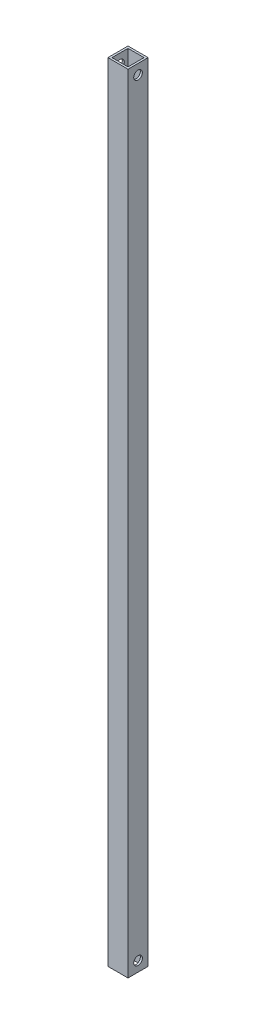
ISO-10303-21;
HEADER;
FILE_DESCRIPTION(('STEP AP214'),'2;1');
FILE_NAME('part.step','',(''),(''),'','','');
FILE_SCHEMA(('AUTOMOTIVE_DESIGN { 1 0 10303 214 1 1 1 1 }'));
ENDSEC;
DATA;
#1=APPLICATION_CONTEXT('core data for automotive mechanical design processes');
#2=APPLICATION_PROTOCOL_DEFINITION('international standard','automotive_design',2000,#1);
#3=PRODUCT_CONTEXT('',#1,'mechanical');
#4=PRODUCT('Part','Part','',(#3));
#5=PRODUCT_RELATED_PRODUCT_CATEGORY('part','',(#4));
#6=PRODUCT_DEFINITION_FORMATION('','',#4);
#7=PRODUCT_DEFINITION_CONTEXT('part definition',#1,'design');
#8=PRODUCT_DEFINITION('design','',#6,#7);
#9=PRODUCT_DEFINITION_SHAPE('','',#8);
#10=(LENGTH_UNIT() NAMED_UNIT(*) SI_UNIT(.MILLI.,.METRE.));
#11=(NAMED_UNIT(*) PLANE_ANGLE_UNIT() SI_UNIT($,.RADIAN.));
#12=(NAMED_UNIT(*) SI_UNIT($,.STERADIAN.) SOLID_ANGLE_UNIT());
#13=UNCERTAINTY_MEASURE_WITH_UNIT(LENGTH_MEASURE(1.E-05),#10,'distance_accuracy_value','');
#14=(GEOMETRIC_REPRESENTATION_CONTEXT(3) GLOBAL_UNCERTAINTY_ASSIGNED_CONTEXT((#13)) GLOBAL_UNIT_ASSIGNED_CONTEXT((#10,
#11,#12)) REPRESENTATION_CONTEXT('',''));
#15=CARTESIAN_POINT('',(0.,0.,0.));
#16=DIRECTION('',(0.,0.,1.));
#17=DIRECTION('',(1.,0.,0.));
#18=AXIS2_PLACEMENT_3D('',#15,#16,#17);
#19=CARTESIAN_POINT('',(0.,391.837661840736,0.));
#20=DIRECTION('',(0.,1.,0.));
#21=DIRECTION('',(0.,0.,1.));
#22=AXIS2_PLACEMENT_3D('',#19,#20,#21);
#23=PLANE('',#22);
#24=DIRECTION('',(0.,0.,-1.));
#25=VECTOR('',#24,1.);
#26=CARTESIAN_POINT('',(5.,391.837661840736,-5.));
#27=LINE('',#26,#25);
#28=CARTESIAN_POINT('',(5.,391.837661840736,5.));
#29=VERTEX_POINT('',#28);
#30=CARTESIAN_POINT('',(5.,391.837661840736,-5.));
#31=VERTEX_POINT('',#30);
#32=EDGE_CURVE('E164',#29,#31,#27,.T.);
#33=ORIENTED_EDGE('',*,*,#32,.T.);
#34=DIRECTION('',(-1.,0.,0.));
#35=VECTOR('',#34,1.);
#36=CARTESIAN_POINT('',(-5.,391.837661840736,-5.));
#37=LINE('',#36,#35);
#38=CARTESIAN_POINT('',(-5.,391.837661840736,-5.));
#39=VERTEX_POINT('',#38);
#40=EDGE_CURVE('E167',#31,#39,#37,.T.);
#41=ORIENTED_EDGE('',*,*,#40,.T.);
#42=DIRECTION('',(0.,0.,1.));
#43=VECTOR('',#42,1.);
#44=CARTESIAN_POINT('',(-5.,391.837661840736,-5.));
#45=LINE('',#44,#43);
#46=CARTESIAN_POINT('',(-5.,391.837661840736,5.));
#47=VERTEX_POINT('',#46);
#48=EDGE_CURVE('E170',#39,#47,#45,.T.);
#49=ORIENTED_EDGE('',*,*,#48,.T.);
#50=DIRECTION('',(1.,0.,0.));
#51=VECTOR('',#50,1.);
#52=CARTESIAN_POINT('',(-5.,391.837661840736,5.));
#53=LINE('',#52,#51);
#54=EDGE_CURVE('E172',#47,#29,#53,.T.);
#55=ORIENTED_EDGE('',*,*,#54,.T.);
#56=EDGE_LOOP('',(#33,#41,#49,#55));
#57=FACE_BOUND('',#56,.T.);
#58=DIRECTION('',(-1.,0.,0.));
#59=VECTOR('',#58,1.);
#60=CARTESIAN_POINT('',(-5.,391.837661840736,-4.));
#61=LINE('',#60,#59);
#62=CARTESIAN_POINT('',(4.,391.837661840736,-4.));
#63=VERTEX_POINT('',#62);
#64=CARTESIAN_POINT('',(-4.,391.837661840736,-4.));
#65=VERTEX_POINT('',#64);
#66=EDGE_CURVE('E134',#63,#65,#61,.T.);
#67=ORIENTED_EDGE('',*,*,#66,.F.);
#68=DIRECTION('',(0.,0.,-1.));
#69=VECTOR('',#68,1.);
#70=CARTESIAN_POINT('',(4.,391.837661840736,-5.));
#71=LINE('',#70,#69);
#72=CARTESIAN_POINT('',(4.,391.837661840736,4.));
#73=VERTEX_POINT('',#72);
#74=EDGE_CURVE('E126',#73,#63,#71,.T.);
#75=ORIENTED_EDGE('',*,*,#74,.F.);
#76=DIRECTION('',(1.,0.,0.));
#77=VECTOR('',#76,1.);
#78=CARTESIAN_POINT('',(-5.,391.837661840736,4.));
#79=LINE('',#78,#77);
#80=CARTESIAN_POINT('',(-4.,391.837661840736,4.));
#81=VERTEX_POINT('',#80);
#82=EDGE_CURVE('E148',#81,#73,#79,.T.);
#83=ORIENTED_EDGE('',*,*,#82,.F.);
#84=DIRECTION('',(0.,0.,1.));
#85=VECTOR('',#84,1.);
#86=CARTESIAN_POINT('',(-4.,391.837661840736,-5.));
#87=LINE('',#86,#85);
#88=EDGE_CURVE('E146',#65,#81,#87,.T.);
#89=ORIENTED_EDGE('',*,*,#88,.F.);
#90=EDGE_LOOP('',(#67,#75,#83,#89));
#91=FACE_BOUND('',#90,.T.);
#92=ADVANCED_FACE('F59',(#57,#91),#23,.T.);
#93=CARTESIAN_POINT('',(0.,0.,0.));
#94=DIRECTION('',(0.,1.,0.));
#95=DIRECTION('',(0.,0.,1.));
#96=AXIS2_PLACEMENT_3D('',#93,#94,#95);
#97=PLANE('',#96);
#98=DIRECTION('',(0.,0.,-1.));
#99=VECTOR('',#98,1.);
#100=CARTESIAN_POINT('',(5.,0.,-5.));
#101=LINE('',#100,#99);
#102=CARTESIAN_POINT('',(5.,0.,5.));
#103=VERTEX_POINT('',#102);
#104=CARTESIAN_POINT('',(5.,0.,-5.));
#105=VERTEX_POINT('',#104);
#106=EDGE_CURVE('E142',#103,#105,#101,.T.);
#107=ORIENTED_EDGE('',*,*,#106,.F.);
#108=DIRECTION('',(1.,0.,0.));
#109=VECTOR('',#108,1.);
#110=CARTESIAN_POINT('',(-5.,0.,5.));
#111=LINE('',#110,#109);
#112=CARTESIAN_POINT('',(-5.,0.,5.));
#113=VERTEX_POINT('',#112);
#114=EDGE_CURVE('E168',#113,#103,#111,.T.);
#115=ORIENTED_EDGE('',*,*,#114,.F.);
#116=DIRECTION('',(0.,0.,1.));
#117=VECTOR('',#116,1.);
#118=CARTESIAN_POINT('',(-5.,0.,-5.));
#119=LINE('',#118,#117);
#120=CARTESIAN_POINT('',(-5.,0.,-5.));
#121=VERTEX_POINT('',#120);
#122=EDGE_CURVE('E179',#121,#113,#119,.T.);
#123=ORIENTED_EDGE('',*,*,#122,.F.);
#124=DIRECTION('',(-1.,0.,0.));
#125=VECTOR('',#124,1.);
#126=CARTESIAN_POINT('',(-5.,0.,-5.));
#127=LINE('',#126,#125);
#128=EDGE_CURVE('E177',#105,#121,#127,.T.);
#129=ORIENTED_EDGE('',*,*,#128,.F.);
#130=EDGE_LOOP('',(#107,#115,#123,#129));
#131=FACE_BOUND('',#130,.T.);
#132=DIRECTION('',(0.,0.,-1.));
#133=VECTOR('',#132,1.);
#134=CARTESIAN_POINT('',(4.,0.,-5.));
#135=LINE('',#134,#133);
#136=CARTESIAN_POINT('',(4.,0.,4.));
#137=VERTEX_POINT('',#136);
#138=CARTESIAN_POINT('',(4.,0.,-4.));
#139=VERTEX_POINT('',#138);
#140=EDGE_CURVE('E84',#137,#139,#135,.T.);
#141=ORIENTED_EDGE('',*,*,#140,.T.);
#142=DIRECTION('',(-1.,0.,0.));
#143=VECTOR('',#142,1.);
#144=CARTESIAN_POINT('',(-5.,0.,-4.));
#145=LINE('',#144,#143);
#146=CARTESIAN_POINT('',(-4.,0.,-4.));
#147=VERTEX_POINT('',#146);
#148=EDGE_CURVE('E141',#139,#147,#145,.T.);
#149=ORIENTED_EDGE('',*,*,#148,.T.);
#150=DIRECTION('',(0.,0.,1.));
#151=VECTOR('',#150,1.);
#152=CARTESIAN_POINT('',(-4.,0.,-5.));
#153=LINE('',#152,#151);
#154=CARTESIAN_POINT('',(-4.,0.,4.));
#155=VERTEX_POINT('',#154);
#156=EDGE_CURVE('E156',#147,#155,#153,.T.);
#157=ORIENTED_EDGE('',*,*,#156,.T.);
#158=DIRECTION('',(1.,0.,0.));
#159=VECTOR('',#158,1.);
#160=CARTESIAN_POINT('',(-5.,0.,4.));
#161=LINE('',#160,#159);
#162=EDGE_CURVE('E135',#155,#137,#161,.T.);
#163=ORIENTED_EDGE('',*,*,#162,.T.);
#164=EDGE_LOOP('',(#141,#149,#157,#163));
#165=FACE_BOUND('',#164,.T.);
#166=ADVANCED_FACE('F226',(#131,#165),#97,.F.);
#167=CARTESIAN_POINT('',(5.,391.837661840736,-5.));
#168=DIRECTION('',(-1.,0.,0.));
#169=DIRECTION('',(0.,0.,1.));
#170=AXIS2_PLACEMENT_3D('',#167,#168,#169);
#171=PLANE('',#170);
#172=CARTESIAN_POINT('',(5.,5.,0.));
#173=DIRECTION('',(1.,0.,0.));
#174=DIRECTION('',(0.,0.,-1.));
#175=AXIS2_PLACEMENT_3D('',#172,#173,#174);
#176=CIRCLE('',#175,2.15);
#177=CARTESIAN_POINT('',(5.,5.,-2.15));
#178=VERTEX_POINT('',#177);
#179=EDGE_CURVE('E197',#178,#178,#176,.T.);
#180=ORIENTED_EDGE('',*,*,#179,.F.);
#181=EDGE_LOOP('',(#180));
#182=FACE_BOUND('',#181,.T.);
#183=CARTESIAN_POINT('',(5.,386.837661840736,0.));
#184=DIRECTION('',(1.,0.,0.));
#185=DIRECTION('',(0.,0.,1.));
#186=AXIS2_PLACEMENT_3D('',#183,#184,#185);
#187=CIRCLE('',#186,2.14999999999999);
#188=CARTESIAN_POINT('',(5.,386.837661840736,2.14999999999999));
#189=VERTEX_POINT('',#188);
#190=EDGE_CURVE('E207',#189,#189,#187,.T.);
#191=ORIENTED_EDGE('',*,*,#190,.F.);
#192=EDGE_LOOP('',(#191));
#193=FACE_BOUND('',#192,.T.);
#194=ORIENTED_EDGE('',*,*,#106,.T.);
#195=DIRECTION('',(0.,-1.,0.));
#196=VECTOR('',#195,1.);
#197=CARTESIAN_POINT('',(5.,391.837661840736,-5.));
#198=LINE('',#197,#196);
#199=EDGE_CURVE('E12',#31,#105,#198,.T.);
#200=ORIENTED_EDGE('',*,*,#199,.F.);
#201=ORIENTED_EDGE('',*,*,#32,.F.);
#202=DIRECTION('',(0.,-1.,0.));
#203=VECTOR('',#202,1.);
#204=CARTESIAN_POINT('',(5.,391.837661840736,5.));
#205=LINE('',#204,#203);
#206=EDGE_CURVE('E174',#29,#103,#205,.T.);
#207=ORIENTED_EDGE('',*,*,#206,.T.);
#208=EDGE_LOOP('',(#194,#200,#201,#207));
#209=FACE_BOUND('',#208,.T.);
#210=ADVANCED_FACE('F61',(#182,#193,#209),#171,.F.);
#211=CARTESIAN_POINT('',(-5.,391.837661840736,-5.));
#212=DIRECTION('',(0.,0.,1.));
#213=DIRECTION('',(1.,0.,0.));
#214=AXIS2_PLACEMENT_3D('',#211,#212,#213);
#215=PLANE('',#214);
#216=ORIENTED_EDGE('',*,*,#128,.T.);
#217=DIRECTION('',(0.,-1.,0.));
#218=VECTOR('',#217,1.);
#219=CARTESIAN_POINT('',(-5.,391.837661840736,-5.));
#220=LINE('',#219,#218);
#221=EDGE_CURVE('E68',#39,#121,#220,.T.);
#222=ORIENTED_EDGE('',*,*,#221,.F.);
#223=ORIENTED_EDGE('',*,*,#40,.F.);
#224=ORIENTED_EDGE('',*,*,#199,.T.);
#225=EDGE_LOOP('',(#216,#222,#223,#224));
#226=FACE_BOUND('',#225,.T.);
#227=ADVANCED_FACE('F252',(#226),#215,.F.);
#228=CARTESIAN_POINT('',(-5.,391.837661840736,-5.));
#229=DIRECTION('',(1.,0.,0.));
#230=DIRECTION('',(0.,0.,-1.));
#231=AXIS2_PLACEMENT_3D('',#228,#229,#230);
#232=PLANE('',#231);
#233=CARTESIAN_POINT('',(-5.,5.,0.));
#234=DIRECTION('',(1.,0.,0.));
#235=DIRECTION('',(0.,0.,-1.));
#236=AXIS2_PLACEMENT_3D('',#233,#234,#235);
#237=CIRCLE('',#236,2.15);
#238=CARTESIAN_POINT('',(-5.,5.,-2.15));
#239=VERTEX_POINT('',#238);
#240=EDGE_CURVE('E191',#239,#239,#237,.T.);
#241=ORIENTED_EDGE('',*,*,#240,.T.);
#242=EDGE_LOOP('',(#241));
#243=FACE_BOUND('',#242,.T.);
#244=CARTESIAN_POINT('',(-5.,386.837661840736,0.));
#245=DIRECTION('',(1.,0.,0.));
#246=DIRECTION('',(0.,0.,1.));
#247=AXIS2_PLACEMENT_3D('',#244,#245,#246);
#248=CIRCLE('',#247,2.14999999999999);
#249=CARTESIAN_POINT('',(-5.,386.837661840736,2.14999999999999));
#250=VERTEX_POINT('',#249);
#251=EDGE_CURVE('E202',#250,#250,#248,.T.);
#252=ORIENTED_EDGE('',*,*,#251,.T.);
#253=EDGE_LOOP('',(#252));
#254=FACE_BOUND('',#253,.T.);
#255=ORIENTED_EDGE('',*,*,#122,.T.);
#256=DIRECTION('',(0.,-1.,0.));
#257=VECTOR('',#256,1.);
#258=CARTESIAN_POINT('',(-5.,391.837661840736,5.));
#259=LINE('',#258,#257);
#260=EDGE_CURVE('E184',#47,#113,#259,.T.);
#261=ORIENTED_EDGE('',*,*,#260,.F.);
#262=ORIENTED_EDGE('',*,*,#48,.F.);
#263=ORIENTED_EDGE('',*,*,#221,.T.);
#264=EDGE_LOOP('',(#255,#261,#262,#263));
#265=FACE_BOUND('',#264,.T.);
#266=ADVANCED_FACE('F249',(#243,#254,#265),#232,.F.);
#267=CARTESIAN_POINT('',(-5.,391.837661840736,5.));
#268=DIRECTION('',(0.,0.,-1.));
#269=DIRECTION('',(-1.,0.,0.));
#270=AXIS2_PLACEMENT_3D('',#267,#268,#269);
#271=PLANE('',#270);
#272=ORIENTED_EDGE('',*,*,#114,.T.);
#273=ORIENTED_EDGE('',*,*,#206,.F.);
#274=ORIENTED_EDGE('',*,*,#54,.F.);
#275=ORIENTED_EDGE('',*,*,#260,.T.);
#276=EDGE_LOOP('',(#272,#273,#274,#275));
#277=FACE_BOUND('',#276,.T.);
#278=ADVANCED_FACE('F246',(#277),#271,.F.);
#279=CARTESIAN_POINT('',(4.,391.837661840736,-5.));
#280=DIRECTION('',(-1.,0.,0.));
#281=DIRECTION('',(0.,0.,1.));
#282=AXIS2_PLACEMENT_3D('',#279,#280,#281);
#283=PLANE('',#282);
#284=CARTESIAN_POINT('',(4.,5.,0.));
#285=DIRECTION('',(-1.,0.,0.));
#286=DIRECTION('',(0.,0.,1.));
#287=AXIS2_PLACEMENT_3D('',#284,#285,#286);
#288=CIRCLE('',#287,2.15);
#289=CARTESIAN_POINT('',(4.,5.,2.15));
#290=VERTEX_POINT('',#289);
#291=EDGE_CURVE('E154',#290,#290,#288,.T.);
#292=ORIENTED_EDGE('',*,*,#291,.F.);
#293=EDGE_LOOP('',(#292));
#294=FACE_BOUND('',#293,.T.);
#295=CARTESIAN_POINT('',(4.,386.837661840736,0.));
#296=DIRECTION('',(-1.,0.,0.));
#297=DIRECTION('',(0.,0.,1.));
#298=AXIS2_PLACEMENT_3D('',#295,#296,#297);
#299=CIRCLE('',#298,2.14999999999999);
#300=CARTESIAN_POINT('',(4.,386.837661840736,2.14999999999999));
#301=VERTEX_POINT('',#300);
#302=EDGE_CURVE('E190',#301,#301,#299,.T.);
#303=ORIENTED_EDGE('',*,*,#302,.F.);
#304=EDGE_LOOP('',(#303));
#305=FACE_BOUND('',#304,.T.);
#306=ORIENTED_EDGE('',*,*,#140,.F.);
#307=DIRECTION('',(0.,-1.,0.));
#308=VECTOR('',#307,1.);
#309=CARTESIAN_POINT('',(4.,391.837661840736,4.));
#310=LINE('',#309,#308);
#311=EDGE_CURVE('E130',#73,#137,#310,.T.);
#312=ORIENTED_EDGE('',*,*,#311,.F.);
#313=ORIENTED_EDGE('',*,*,#74,.T.);
#314=DIRECTION('',(0.,-1.,0.));
#315=VECTOR('',#314,1.);
#316=CARTESIAN_POINT('',(4.,391.837661840736,-4.));
#317=LINE('',#316,#315);
#318=EDGE_CURVE('E129',#63,#139,#317,.T.);
#319=ORIENTED_EDGE('',*,*,#318,.T.);
#320=EDGE_LOOP('',(#306,#312,#313,#319));
#321=FACE_BOUND('',#320,.T.);
#322=ADVANCED_FACE('F128',(#294,#305,#321),#283,.T.);
#323=CARTESIAN_POINT('',(-5.,391.837661840736,-4.));
#324=DIRECTION('',(0.,0.,1.));
#325=DIRECTION('',(1.,0.,0.));
#326=AXIS2_PLACEMENT_3D('',#323,#324,#325);
#327=PLANE('',#326);
#328=ORIENTED_EDGE('',*,*,#148,.F.);
#329=ORIENTED_EDGE('',*,*,#318,.F.);
#330=ORIENTED_EDGE('',*,*,#66,.T.);
#331=DIRECTION('',(0.,-1.,0.));
#332=VECTOR('',#331,1.);
#333=CARTESIAN_POINT('',(-4.,391.837661840736,-4.));
#334=LINE('',#333,#332);
#335=EDGE_CURVE('E143',#65,#147,#334,.T.);
#336=ORIENTED_EDGE('',*,*,#335,.T.);
#337=EDGE_LOOP('',(#328,#329,#330,#336));
#338=FACE_BOUND('',#337,.T.);
#339=ADVANCED_FACE('F138',(#338),#327,.T.);
#340=CARTESIAN_POINT('',(-4.,391.837661840736,-5.));
#341=DIRECTION('',(1.,0.,0.));
#342=DIRECTION('',(0.,0.,-1.));
#343=AXIS2_PLACEMENT_3D('',#340,#341,#342);
#344=PLANE('',#343);
#345=CARTESIAN_POINT('',(-4.,5.,0.));
#346=DIRECTION('',(1.,0.,0.));
#347=DIRECTION('',(0.,0.,-1.));
#348=AXIS2_PLACEMENT_3D('',#345,#346,#347);
#349=CIRCLE('',#348,2.15);
#350=CARTESIAN_POINT('',(-4.,5.,-2.15));
#351=VERTEX_POINT('',#350);
#352=EDGE_CURVE('E63',#351,#351,#349,.T.);
#353=ORIENTED_EDGE('',*,*,#352,.F.);
#354=EDGE_LOOP('',(#353));
#355=FACE_BOUND('',#354,.T.);
#356=CARTESIAN_POINT('',(-4.,386.837661840736,0.));
#357=DIRECTION('',(1.,0.,0.));
#358=DIRECTION('',(0.,0.,-1.));
#359=AXIS2_PLACEMENT_3D('',#356,#357,#358);
#360=CIRCLE('',#359,2.14999999999999);
#361=CARTESIAN_POINT('',(-4.,386.837661840736,-2.14999999999999));
#362=VERTEX_POINT('',#361);
#363=EDGE_CURVE('E188',#362,#362,#360,.T.);
#364=ORIENTED_EDGE('',*,*,#363,.F.);
#365=EDGE_LOOP('',(#364));
#366=FACE_BOUND('',#365,.T.);
#367=ORIENTED_EDGE('',*,*,#156,.F.);
#368=ORIENTED_EDGE('',*,*,#335,.F.);
#369=ORIENTED_EDGE('',*,*,#88,.T.);
#370=DIRECTION('',(0.,-1.,0.));
#371=VECTOR('',#370,1.);
#372=CARTESIAN_POINT('',(-4.,391.837661840736,4.));
#373=LINE('',#372,#371);
#374=EDGE_CURVE('E76',#81,#155,#373,.T.);
#375=ORIENTED_EDGE('',*,*,#374,.T.);
#376=EDGE_LOOP('',(#367,#368,#369,#375));
#377=FACE_BOUND('',#376,.T.);
#378=ADVANCED_FACE('F218',(#355,#366,#377),#344,.T.);
#379=CARTESIAN_POINT('',(-5.,391.837661840736,4.));
#380=DIRECTION('',(0.,0.,-1.));
#381=DIRECTION('',(-1.,0.,0.));
#382=AXIS2_PLACEMENT_3D('',#379,#380,#381);
#383=PLANE('',#382);
#384=ORIENTED_EDGE('',*,*,#162,.F.);
#385=ORIENTED_EDGE('',*,*,#374,.F.);
#386=ORIENTED_EDGE('',*,*,#82,.T.);
#387=ORIENTED_EDGE('',*,*,#311,.T.);
#388=EDGE_LOOP('',(#384,#385,#386,#387));
#389=FACE_BOUND('',#388,.T.);
#390=ADVANCED_FACE('F221',(#389),#383,.T.);
#391=CARTESIAN_POINT('',(-5.,386.837661840736,0.));
#392=DIRECTION('',(1.,0.,0.));
#393=DIRECTION('',(0.,0.,-1.));
#394=AXIS2_PLACEMENT_3D('',#391,#392,#393);
#395=CYLINDRICAL_SURFACE('',#394,2.14999999999999);
#396=ORIENTED_EDGE('',*,*,#363,.T.);
#397=EDGE_LOOP('',(#396));
#398=FACE_BOUND('',#397,.T.);
#399=ORIENTED_EDGE('',*,*,#251,.F.);
#400=EDGE_LOOP('',(#399));
#401=FACE_BOUND('',#400,.T.);
#402=ADVANCED_FACE('F228',(#398,#401),#395,.F.);
#403=CARTESIAN_POINT('',(-5.,5.,0.));
#404=DIRECTION('',(1.,0.,0.));
#405=DIRECTION('',(0.,0.,-1.));
#406=AXIS2_PLACEMENT_3D('',#403,#404,#405);
#407=CYLINDRICAL_SURFACE('',#406,2.15);
#408=ORIENTED_EDGE('',*,*,#352,.T.);
#409=EDGE_LOOP('',(#408));
#410=FACE_BOUND('',#409,.T.);
#411=ORIENTED_EDGE('',*,*,#240,.F.);
#412=EDGE_LOOP('',(#411));
#413=FACE_BOUND('',#412,.T.);
#414=ADVANCED_FACE('F215',(#410,#413),#407,.F.);
#415=ORIENTED_EDGE('',*,*,#302,.T.);
#416=EDGE_LOOP('',(#415));
#417=FACE_BOUND('',#416,.T.);
#418=ORIENTED_EDGE('',*,*,#190,.T.);
#419=EDGE_LOOP('',(#418));
#420=FACE_BOUND('',#419,.T.);
#421=ADVANCED_FACE('F234',(#417,#420),#395,.F.);
#422=ORIENTED_EDGE('',*,*,#291,.T.);
#423=EDGE_LOOP('',(#422));
#424=FACE_BOUND('',#423,.T.);
#425=ORIENTED_EDGE('',*,*,#179,.T.);
#426=EDGE_LOOP('',(#425));
#427=FACE_BOUND('',#426,.T.);
#428=ADVANCED_FACE('F278',(#424,#427),#407,.F.);
#429=CLOSED_SHELL('',(#92,#166,#210,#227,#266,#278,#322,#339,#378,#390,#402,#414,#421,#428));
#430=MANIFOLD_SOLID_BREP('B2',#429);
#431=ADVANCED_BREP_SHAPE_REPRESENTATION('',(#18,#430),#14);
#432=SHAPE_DEFINITION_REPRESENTATION(#9,#431);
ENDSEC;
END-ISO-10303-21;
